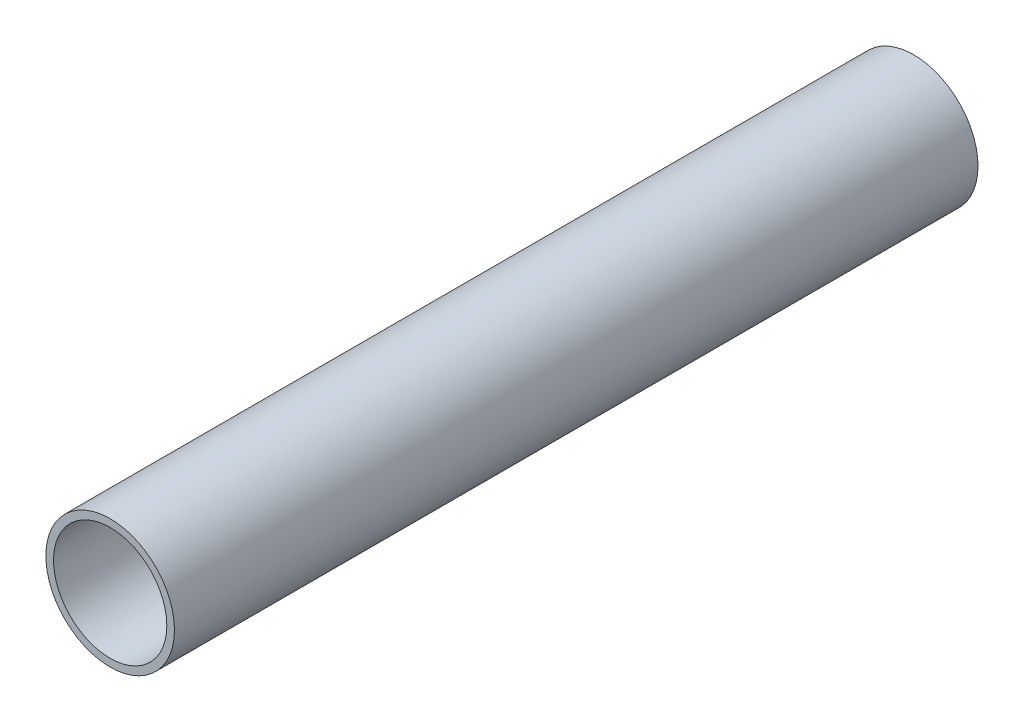
ISO-10303-21;
HEADER;
FILE_DESCRIPTION(('STEP AP214'),'2;1');
FILE_NAME('part.step','',(''),(''),'','','');
FILE_SCHEMA(('AUTOMOTIVE_DESIGN { 1 0 10303 214 1 1 1 1 }'));
ENDSEC;
DATA;
#1=APPLICATION_CONTEXT('core data for automotive mechanical design processes');
#2=APPLICATION_PROTOCOL_DEFINITION('international standard','automotive_design',2000,#1);
#3=PRODUCT_CONTEXT('',#1,'mechanical');
#4=PRODUCT('Part','Part','',(#3));
#5=PRODUCT_RELATED_PRODUCT_CATEGORY('part','',(#4));
#6=PRODUCT_DEFINITION_FORMATION('','',#4);
#7=PRODUCT_DEFINITION_CONTEXT('part definition',#1,'design');
#8=PRODUCT_DEFINITION('design','',#6,#7);
#9=PRODUCT_DEFINITION_SHAPE('','',#8);
#10=(LENGTH_UNIT() NAMED_UNIT(*) SI_UNIT(.MILLI.,.METRE.));
#11=(NAMED_UNIT(*) PLANE_ANGLE_UNIT() SI_UNIT($,.RADIAN.));
#12=(NAMED_UNIT(*) SI_UNIT($,.STERADIAN.) SOLID_ANGLE_UNIT());
#13=UNCERTAINTY_MEASURE_WITH_UNIT(LENGTH_MEASURE(1.E-05),#10,'distance_accuracy_value','');
#14=(GEOMETRIC_REPRESENTATION_CONTEXT(3) GLOBAL_UNCERTAINTY_ASSIGNED_CONTEXT((#13)) GLOBAL_UNIT_ASSIGNED_CONTEXT((#10,
#11,#12)) REPRESENTATION_CONTEXT('',''));
#15=CARTESIAN_POINT('',(0.,0.,0.));
#16=DIRECTION('',(0.,0.,1.));
#17=DIRECTION('',(1.,0.,0.));
#18=AXIS2_PLACEMENT_3D('',#15,#16,#17);
#19=CARTESIAN_POINT('',(0.,0.,200.));
#20=DIRECTION('',(0.,0.,1.));
#21=DIRECTION('',(1.,0.,0.));
#22=AXIS2_PLACEMENT_3D('',#19,#20,#21);
#23=PLANE('',#22);
#24=CARTESIAN_POINT('',(0.,0.,200.));
#25=DIRECTION('',(0.,0.,1.));
#26=DIRECTION('',(1.,0.,0.));
#27=AXIS2_PLACEMENT_3D('',#24,#25,#26);
#28=CIRCLE('',#27,16.);
#29=CARTESIAN_POINT('',(16.,0.,200.));
#30=VERTEX_POINT('',#29);
#31=EDGE_CURVE('E10',#30,#30,#28,.T.);
#32=ORIENTED_EDGE('',*,*,#31,.T.);
#33=EDGE_LOOP('',(#32));
#34=FACE_BOUND('',#33,.T.);
#35=CARTESIAN_POINT('',(0.,0.,200.));
#36=DIRECTION('',(0.,0.,1.));
#37=DIRECTION('',(1.,0.,0.));
#38=AXIS2_PLACEMENT_3D('',#35,#36,#37);
#39=CIRCLE('',#38,14.1);
#40=CARTESIAN_POINT('',(14.1,0.,200.));
#41=VERTEX_POINT('',#40);
#42=EDGE_CURVE('E42',#41,#41,#39,.T.);
#43=ORIENTED_EDGE('',*,*,#42,.F.);
#44=EDGE_LOOP('',(#43));
#45=FACE_BOUND('',#44,.T.);
#46=ADVANCED_FACE('F31',(#34,#45),#23,.T.);
#47=CARTESIAN_POINT('',(0.,0.,0.));
#48=DIRECTION('',(0.,0.,1.));
#49=DIRECTION('',(1.,0.,0.));
#50=AXIS2_PLACEMENT_3D('',#47,#48,#49);
#51=PLANE('',#50);
#52=CARTESIAN_POINT('',(0.,0.,0.));
#53=DIRECTION('',(0.,0.,1.));
#54=DIRECTION('',(1.,0.,0.));
#55=AXIS2_PLACEMENT_3D('',#52,#53,#54);
#56=CIRCLE('',#55,16.);
#57=CARTESIAN_POINT('',(16.,0.,0.));
#58=VERTEX_POINT('',#57);
#59=EDGE_CURVE('E35',#58,#58,#56,.T.);
#60=ORIENTED_EDGE('',*,*,#59,.F.);
#61=EDGE_LOOP('',(#60));
#62=FACE_BOUND('',#61,.T.);
#63=CARTESIAN_POINT('',(0.,0.,0.));
#64=DIRECTION('',(0.,0.,1.));
#65=DIRECTION('',(1.,0.,0.));
#66=AXIS2_PLACEMENT_3D('',#63,#64,#65);
#67=CIRCLE('',#66,14.1);
#68=CARTESIAN_POINT('',(14.1,0.,0.));
#69=VERTEX_POINT('',#68);
#70=EDGE_CURVE('E44',#69,#69,#67,.T.);
#71=ORIENTED_EDGE('',*,*,#70,.T.);
#72=EDGE_LOOP('',(#71));
#73=FACE_BOUND('',#72,.T.);
#74=ADVANCED_FACE('F54',(#62,#73),#51,.F.);
#75=CARTESIAN_POINT('',(0.,0.,200.));
#76=DIRECTION('',(0.,0.,-1.));
#77=DIRECTION('',(-1.,0.,0.));
#78=AXIS2_PLACEMENT_3D('',#75,#76,#77);
#79=CYLINDRICAL_SURFACE('',#78,16.);
#80=ORIENTED_EDGE('',*,*,#31,.F.);
#81=EDGE_LOOP('',(#80));
#82=FACE_BOUND('',#81,.T.);
#83=ORIENTED_EDGE('',*,*,#59,.T.);
#84=EDGE_LOOP('',(#83));
#85=FACE_BOUND('',#84,.T.);
#86=ADVANCED_FACE('F33',(#82,#85),#79,.T.);
#87=CARTESIAN_POINT('',(0.,0.,200.));
#88=DIRECTION('',(0.,0.,-1.));
#89=DIRECTION('',(-1.,0.,0.));
#90=AXIS2_PLACEMENT_3D('',#87,#88,#89);
#91=CYLINDRICAL_SURFACE('',#90,14.1);
#92=ORIENTED_EDGE('',*,*,#42,.T.);
#93=EDGE_LOOP('',(#92));
#94=FACE_BOUND('',#93,.T.);
#95=ORIENTED_EDGE('',*,*,#70,.F.);
#96=EDGE_LOOP('',(#95));
#97=FACE_BOUND('',#96,.T.);
#98=ADVANCED_FACE('F50',(#94,#97),#91,.F.);
#99=CLOSED_SHELL('',(#46,#74,#86,#98));
#100=MANIFOLD_SOLID_BREP('B2',#99);
#101=ADVANCED_BREP_SHAPE_REPRESENTATION('',(#18,#100),#14);
#102=SHAPE_DEFINITION_REPRESENTATION(#9,#101);
ENDSEC;
END-ISO-10303-21;
